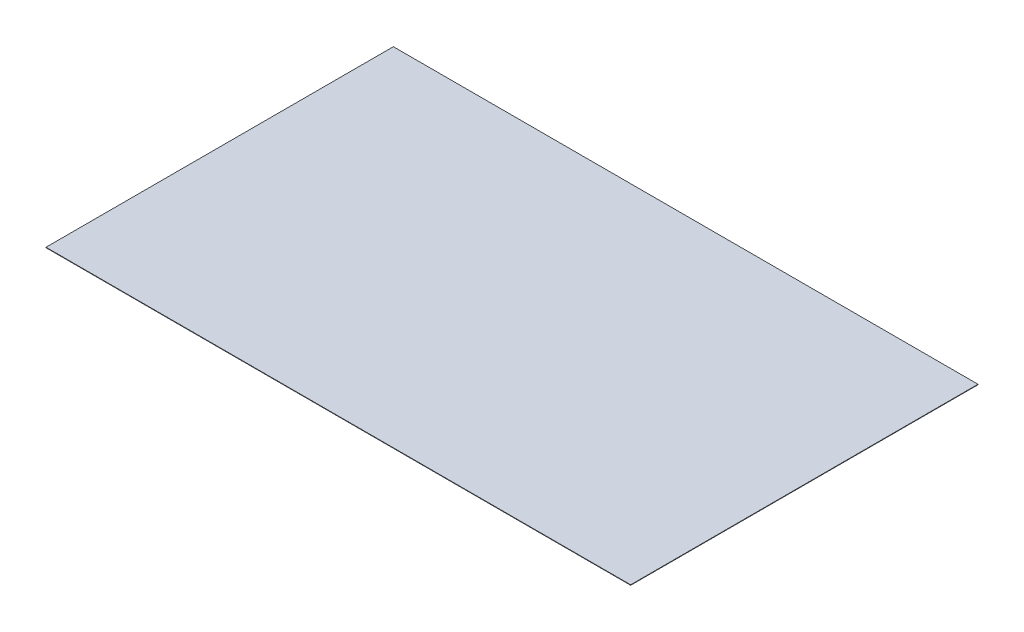
ISO-10303-21;
HEADER;
FILE_DESCRIPTION(('STEP AP214'),'2;1');
FILE_NAME('part.step','',(''),(''),'','','');
FILE_SCHEMA(('AUTOMOTIVE_DESIGN { 1 0 10303 214 1 1 1 1 }'));
ENDSEC;
DATA;
#1=APPLICATION_CONTEXT('core data for automotive mechanical design processes');
#2=APPLICATION_PROTOCOL_DEFINITION('international standard','automotive_design',2000,#1);
#3=PRODUCT_CONTEXT('',#1,'mechanical');
#4=PRODUCT('Part','Part','',(#3));
#5=PRODUCT_RELATED_PRODUCT_CATEGORY('part','',(#4));
#6=PRODUCT_DEFINITION_FORMATION('','',#4);
#7=PRODUCT_DEFINITION_CONTEXT('part definition',#1,'design');
#8=PRODUCT_DEFINITION('design','',#6,#7);
#9=PRODUCT_DEFINITION_SHAPE('','',#8);
#10=(LENGTH_UNIT() NAMED_UNIT(*) SI_UNIT(.MILLI.,.METRE.));
#11=(NAMED_UNIT(*) PLANE_ANGLE_UNIT() SI_UNIT($,.RADIAN.));
#12=(NAMED_UNIT(*) SI_UNIT($,.STERADIAN.) SOLID_ANGLE_UNIT());
#13=UNCERTAINTY_MEASURE_WITH_UNIT(LENGTH_MEASURE(1.E-05),#10,'distance_accuracy_value','');
#14=(GEOMETRIC_REPRESENTATION_CONTEXT(3) GLOBAL_UNCERTAINTY_ASSIGNED_CONTEXT((#13)) GLOBAL_UNIT_ASSIGNED_CONTEXT((#10,
#11,#12)) REPRESENTATION_CONTEXT('',''));
#15=CARTESIAN_POINT('',(0.,0.,0.));
#16=DIRECTION('',(0.,0.,1.));
#17=DIRECTION('',(1.,0.,0.));
#18=AXIS2_PLACEMENT_3D('',#15,#16,#17);
#19=CARTESIAN_POINT('',(62.5,690.,-757.5));
#20=DIRECTION('',(-1.,0.,0.));
#21=DIRECTION('',(0.,0.,1.));
#22=AXIS2_PLACEMENT_3D('',#19,#20,#21);
#23=PLANE('',#22);
#24=DIRECTION('',(0.,-1.,0.));
#25=VECTOR('',#24,1.);
#26=CARTESIAN_POINT('',(62.5,690.,0.));
#27=LINE('',#26,#25);
#28=CARTESIAN_POINT('',(62.5,691.,0.));
#29=VERTEX_POINT('',#28);
#30=CARTESIAN_POINT('',(62.5,690.,0.));
#31=VERTEX_POINT('',#30);
#32=EDGE_CURVE('E103',#29,#31,#27,.T.);
#33=ORIENTED_EDGE('',*,*,#32,.F.);
#34=DIRECTION('',(0.,0.,1.));
#35=VECTOR('',#34,1.);
#36=CARTESIAN_POINT('',(62.5,691.,-757.5));
#37=LINE('',#36,#35);
#38=CARTESIAN_POINT('',(62.5,691.,-757.5));
#39=VERTEX_POINT('',#38);
#40=EDGE_CURVE('E11',#39,#29,#37,.T.);
#41=ORIENTED_EDGE('',*,*,#40,.F.);
#42=DIRECTION('',(0.,-1.,0.));
#43=VECTOR('',#42,1.);
#44=CARTESIAN_POINT('',(62.5,690.,-757.5));
#45=LINE('',#44,#43);
#46=CARTESIAN_POINT('',(62.5,690.,-757.5));
#47=VERTEX_POINT('',#46);
#48=EDGE_CURVE('E97',#39,#47,#45,.T.);
#49=ORIENTED_EDGE('',*,*,#48,.T.);
#50=DIRECTION('',(0.,0.,1.));
#51=VECTOR('',#50,1.);
#52=CARTESIAN_POINT('',(62.5,690.,-757.5));
#53=LINE('',#52,#51);
#54=EDGE_CURVE('E42',#47,#31,#53,.T.);
#55=ORIENTED_EDGE('',*,*,#54,.T.);
#56=EDGE_LOOP('',(#33,#41,#49,#55));
#57=FACE_BOUND('',#56,.T.);
#58=ADVANCED_FACE('F39',(#57),#23,.T.);
#59=CARTESIAN_POINT('',(62.5,691.,-757.5));
#60=DIRECTION('',(0.,1.,0.));
#61=DIRECTION('',(0.,0.,1.));
#62=AXIS2_PLACEMENT_3D('',#59,#60,#61);
#63=PLANE('',#62);
#64=DIRECTION('',(-1.,0.,0.));
#65=VECTOR('',#64,1.);
#66=CARTESIAN_POINT('',(62.5,691.,0.));
#67=LINE('',#66,#65);
#68=CARTESIAN_POINT('',(1337.5,691.,0.));
#69=VERTEX_POINT('',#68);
#70=EDGE_CURVE('E99',#69,#29,#67,.T.);
#71=ORIENTED_EDGE('',*,*,#70,.F.);
#72=DIRECTION('',(0.,0.,1.));
#73=VECTOR('',#72,1.);
#74=CARTESIAN_POINT('',(1337.5,691.,-757.5));
#75=LINE('',#74,#73);
#76=CARTESIAN_POINT('',(1337.5,691.,-757.5));
#77=VERTEX_POINT('',#76);
#78=EDGE_CURVE('E48',#77,#69,#75,.T.);
#79=ORIENTED_EDGE('',*,*,#78,.F.);
#80=DIRECTION('',(-1.,0.,0.));
#81=VECTOR('',#80,1.);
#82=CARTESIAN_POINT('',(62.5,691.,-757.5));
#83=LINE('',#82,#81);
#84=EDGE_CURVE('E94',#77,#39,#83,.T.);
#85=ORIENTED_EDGE('',*,*,#84,.T.);
#86=ORIENTED_EDGE('',*,*,#40,.T.);
#87=EDGE_LOOP('',(#71,#79,#85,#86));
#88=FACE_BOUND('',#87,.T.);
#89=ADVANCED_FACE('F113',(#88),#63,.T.);
#90=CARTESIAN_POINT('',(1337.5,690.,-757.5));
#91=DIRECTION('',(1.,0.,0.));
#92=DIRECTION('',(0.,0.,-1.));
#93=AXIS2_PLACEMENT_3D('',#90,#91,#92);
#94=PLANE('',#93);
#95=DIRECTION('',(0.,1.,0.));
#96=VECTOR('',#95,1.);
#97=CARTESIAN_POINT('',(1337.5,690.,0.));
#98=LINE('',#97,#96);
#99=CARTESIAN_POINT('',(1337.5,690.,0.));
#100=VERTEX_POINT('',#99);
#101=EDGE_CURVE('E89',#100,#69,#98,.T.);
#102=ORIENTED_EDGE('',*,*,#101,.F.);
#103=DIRECTION('',(0.,0.,1.));
#104=VECTOR('',#103,1.);
#105=CARTESIAN_POINT('',(1337.5,690.,-757.5));
#106=LINE('',#105,#104);
#107=CARTESIAN_POINT('',(1337.5,690.,-757.5));
#108=VERTEX_POINT('',#107);
#109=EDGE_CURVE('E84',#108,#100,#106,.T.);
#110=ORIENTED_EDGE('',*,*,#109,.F.);
#111=DIRECTION('',(0.,1.,0.));
#112=VECTOR('',#111,1.);
#113=CARTESIAN_POINT('',(1337.5,690.,-757.5));
#114=LINE('',#113,#112);
#115=EDGE_CURVE('E87',#108,#77,#114,.T.);
#116=ORIENTED_EDGE('',*,*,#115,.T.);
#117=ORIENTED_EDGE('',*,*,#78,.T.);
#118=EDGE_LOOP('',(#102,#110,#116,#117));
#119=FACE_BOUND('',#118,.T.);
#120=ADVANCED_FACE('F86',(#119),#94,.T.);
#121=CARTESIAN_POINT('',(62.5,690.,-757.5));
#122=DIRECTION('',(0.,-1.,0.));
#123=DIRECTION('',(0.,0.,-1.));
#124=AXIS2_PLACEMENT_3D('',#121,#122,#123);
#125=PLANE('',#124);
#126=DIRECTION('',(1.,0.,0.));
#127=VECTOR('',#126,1.);
#128=CARTESIAN_POINT('',(62.5,690.,0.));
#129=LINE('',#128,#127);
#130=EDGE_CURVE('E106',#31,#100,#129,.T.);
#131=ORIENTED_EDGE('',*,*,#130,.F.);
#132=ORIENTED_EDGE('',*,*,#54,.F.);
#133=DIRECTION('',(1.,0.,0.));
#134=VECTOR('',#133,1.);
#135=CARTESIAN_POINT('',(62.5,690.,-757.5));
#136=LINE('',#135,#134);
#137=EDGE_CURVE('E93',#47,#108,#136,.T.);
#138=ORIENTED_EDGE('',*,*,#137,.T.);
#139=ORIENTED_EDGE('',*,*,#109,.T.);
#140=EDGE_LOOP('',(#131,#132,#138,#139));
#141=FACE_BOUND('',#140,.T.);
#142=ADVANCED_FACE('F96',(#141),#125,.T.);
#143=CARTESIAN_POINT('',(0.,0.,-757.5));
#144=DIRECTION('',(0.,0.,-1.));
#145=DIRECTION('',(-1.,0.,0.));
#146=AXIS2_PLACEMENT_3D('',#143,#144,#145);
#147=PLANE('',#146);
#148=ORIENTED_EDGE('',*,*,#48,.F.);
#149=ORIENTED_EDGE('',*,*,#84,.F.);
#150=ORIENTED_EDGE('',*,*,#115,.F.);
#151=ORIENTED_EDGE('',*,*,#137,.F.);
#152=EDGE_LOOP('',(#148,#149,#150,#151));
#153=FACE_BOUND('',#152,.T.);
#154=ADVANCED_FACE('F92',(#153),#147,.T.);
#155=CARTESIAN_POINT('',(0.,0.,0.));
#156=DIRECTION('',(0.,0.,-1.));
#157=DIRECTION('',(-1.,0.,0.));
#158=AXIS2_PLACEMENT_3D('',#155,#156,#157);
#159=PLANE('',#158);
#160=ORIENTED_EDGE('',*,*,#32,.T.);
#161=ORIENTED_EDGE('',*,*,#130,.T.);
#162=ORIENTED_EDGE('',*,*,#101,.T.);
#163=ORIENTED_EDGE('',*,*,#70,.T.);
#164=EDGE_LOOP('',(#160,#161,#162,#163));
#165=FACE_BOUND('',#164,.T.);
#166=ADVANCED_FACE('F112',(#165),#159,.F.);
#167=CLOSED_SHELL('',(#58,#89,#120,#142,#154,#166));
#168=MANIFOLD_SOLID_BREP('B2',#167);
#169=ADVANCED_BREP_SHAPE_REPRESENTATION('',(#18,#168),#14);
#170=SHAPE_DEFINITION_REPRESENTATION(#9,#169);
ENDSEC;
END-ISO-10303-21;
